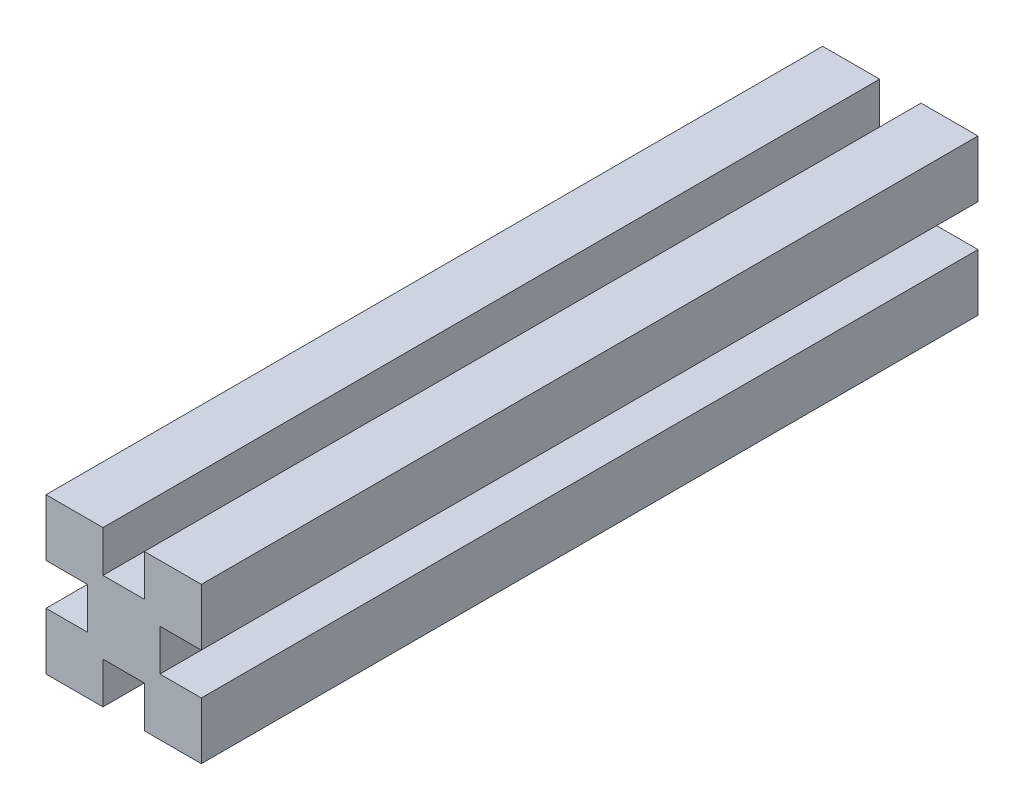
ISO-10303-21;
HEADER;
FILE_DESCRIPTION(('STEP AP214'),'2;1');
FILE_NAME('part.step','',(''),(''),'','','');
FILE_SCHEMA(('AUTOMOTIVE_DESIGN { 1 0 10303 214 1 1 1 1 }'));
ENDSEC;
DATA;
#1=APPLICATION_CONTEXT('core data for automotive mechanical design processes');
#2=APPLICATION_PROTOCOL_DEFINITION('international standard','automotive_design',2000,#1);
#3=PRODUCT_CONTEXT('',#1,'mechanical');
#4=PRODUCT('Part','Part','',(#3));
#5=PRODUCT_RELATED_PRODUCT_CATEGORY('part','',(#4));
#6=PRODUCT_DEFINITION_FORMATION('','',#4);
#7=PRODUCT_DEFINITION_CONTEXT('part definition',#1,'design');
#8=PRODUCT_DEFINITION('design','',#6,#7);
#9=PRODUCT_DEFINITION_SHAPE('','',#8);
#10=(LENGTH_UNIT() NAMED_UNIT(*) SI_UNIT(.MILLI.,.METRE.));
#11=(NAMED_UNIT(*) PLANE_ANGLE_UNIT() SI_UNIT($,.RADIAN.));
#12=(NAMED_UNIT(*) SI_UNIT($,.STERADIAN.) SOLID_ANGLE_UNIT());
#13=UNCERTAINTY_MEASURE_WITH_UNIT(LENGTH_MEASURE(1.E-05),#10,'distance_accuracy_value','');
#14=(GEOMETRIC_REPRESENTATION_CONTEXT(3) GLOBAL_UNCERTAINTY_ASSIGNED_CONTEXT((#13)) GLOBAL_UNIT_ASSIGNED_CONTEXT((#10,
#11,#12)) REPRESENTATION_CONTEXT('',''));
#15=CARTESIAN_POINT('',(0.,0.,0.));
#16=DIRECTION('',(0.,0.,1.));
#17=DIRECTION('',(1.,0.,0.));
#18=AXIS2_PLACEMENT_3D('',#15,#16,#17);
#19=CARTESIAN_POINT('',(-4.,-7.,75.));
#20=DIRECTION('',(-1.,0.,0.));
#21=DIRECTION('',(0.,0.,1.));
#22=AXIS2_PLACEMENT_3D('',#19,#20,#21);
#23=PLANE('',#22);
#24=DIRECTION('',(0.,1.,0.));
#25=VECTOR('',#24,1.);
#26=CARTESIAN_POINT('',(-4.,0.,75.));
#27=LINE('',#26,#25);
#28=CARTESIAN_POINT('',(-4.,-15.,75.));
#29=VERTEX_POINT('',#28);
#30=CARTESIAN_POINT('',(-4.,-7.,75.));
#31=VERTEX_POINT('',#30);
#32=EDGE_CURVE('E223',#29,#31,#27,.T.);
#33=ORIENTED_EDGE('',*,*,#32,.F.);
#34=DIRECTION('',(0.,0.,-1.));
#35=VECTOR('',#34,1.);
#36=CARTESIAN_POINT('',(-4.,-15.,-75.));
#37=LINE('',#36,#35);
#38=CARTESIAN_POINT('',(-4.,-15.,-75.));
#39=VERTEX_POINT('',#38);
#40=EDGE_CURVE('E160',#39,#29,#37,.F.);
#41=ORIENTED_EDGE('',*,*,#40,.F.);
#42=DIRECTION('',(0.,1.,0.));
#43=VECTOR('',#42,1.);
#44=CARTESIAN_POINT('',(-4.,0.,-75.));
#45=LINE('',#44,#43);
#46=CARTESIAN_POINT('',(-4.,-7.,-75.));
#47=VERTEX_POINT('',#46);
#48=EDGE_CURVE('E157',#39,#47,#45,.T.);
#49=ORIENTED_EDGE('',*,*,#48,.T.);
#50=DIRECTION('',(0.,0.,1.));
#51=VECTOR('',#50,1.);
#52=CARTESIAN_POINT('',(-4.,-7.,75.));
#53=LINE('',#52,#51);
#54=EDGE_CURVE('E20',#47,#31,#53,.T.);
#55=ORIENTED_EDGE('',*,*,#54,.T.);
#56=EDGE_LOOP('',(#33,#41,#49,#55));
#57=FACE_BOUND('',#56,.T.);
#58=ADVANCED_FACE('F17',(#57),#23,.F.);
#59=CARTESIAN_POINT('',(4.,-7.,75.));
#60=DIRECTION('',(0.,1.,0.));
#61=DIRECTION('',(0.,0.,1.));
#62=AXIS2_PLACEMENT_3D('',#59,#60,#61);
#63=PLANE('',#62);
#64=DIRECTION('',(1.,0.,0.));
#65=VECTOR('',#64,1.);
#66=CARTESIAN_POINT('',(0.,-7.,75.));
#67=LINE('',#66,#65);
#68=CARTESIAN_POINT('',(4.,-7.,75.));
#69=VERTEX_POINT('',#68);
#70=EDGE_CURVE('E167',#31,#69,#67,.T.);
#71=ORIENTED_EDGE('',*,*,#70,.F.);
#72=ORIENTED_EDGE('',*,*,#54,.F.);
#73=DIRECTION('',(1.,0.,0.));
#74=VECTOR('',#73,1.);
#75=CARTESIAN_POINT('',(0.,-7.,-75.));
#76=LINE('',#75,#74);
#77=CARTESIAN_POINT('',(4.,-7.,-75.));
#78=VERTEX_POINT('',#77);
#79=EDGE_CURVE('E152',#47,#78,#76,.T.);
#80=ORIENTED_EDGE('',*,*,#79,.T.);
#81=DIRECTION('',(0.,0.,-1.));
#82=VECTOR('',#81,1.);
#83=CARTESIAN_POINT('',(4.,-7.,75.));
#84=LINE('',#83,#82);
#85=EDGE_CURVE('E169',#78,#69,#84,.F.);
#86=ORIENTED_EDGE('',*,*,#85,.T.);
#87=EDGE_LOOP('',(#71,#72,#80,#86));
#88=FACE_BOUND('',#87,.T.);
#89=ADVANCED_FACE('F165',(#88),#63,.F.);
#90=CARTESIAN_POINT('',(4.,-15.,75.));
#91=DIRECTION('',(1.,0.,0.));
#92=DIRECTION('',(0.,0.,-1.));
#93=AXIS2_PLACEMENT_3D('',#90,#91,#92);
#94=PLANE('',#93);
#95=DIRECTION('',(0.,1.,0.));
#96=VECTOR('',#95,1.);
#97=CARTESIAN_POINT('',(4.,0.,75.));
#98=LINE('',#97,#96);
#99=CARTESIAN_POINT('',(4.,-15.,75.));
#100=VERTEX_POINT('',#99);
#101=EDGE_CURVE('E215',#69,#100,#98,.F.);
#102=ORIENTED_EDGE('',*,*,#101,.F.);
#103=ORIENTED_EDGE('',*,*,#85,.F.);
#104=DIRECTION('',(0.,1.,0.));
#105=VECTOR('',#104,1.);
#106=CARTESIAN_POINT('',(4.,0.,-75.));
#107=LINE('',#106,#105);
#108=CARTESIAN_POINT('',(4.,-15.,-75.));
#109=VERTEX_POINT('',#108);
#110=EDGE_CURVE('E174',#78,#109,#107,.F.);
#111=ORIENTED_EDGE('',*,*,#110,.T.);
#112=DIRECTION('',(0.,0.,-1.));
#113=VECTOR('',#112,1.);
#114=CARTESIAN_POINT('',(4.,-15.,-75.));
#115=LINE('',#114,#113);
#116=EDGE_CURVE('E210',#100,#109,#115,.T.);
#117=ORIENTED_EDGE('',*,*,#116,.F.);
#118=EDGE_LOOP('',(#102,#103,#111,#117));
#119=FACE_BOUND('',#118,.T.);
#120=ADVANCED_FACE('F216',(#119),#94,.F.);
#121=CARTESIAN_POINT('',(-15.,-15.,-75.));
#122=DIRECTION('',(0.,-1.,0.));
#123=DIRECTION('',(0.,0.,-1.));
#124=AXIS2_PLACEMENT_3D('',#121,#122,#123);
#125=PLANE('',#124);
#126=DIRECTION('',(1.,0.,0.));
#127=VECTOR('',#126,1.);
#128=CARTESIAN_POINT('',(0.,-15.,75.));
#129=LINE('',#128,#127);
#130=CARTESIAN_POINT('',(15.,-15.,75.));
#131=VERTEX_POINT('',#130);
#132=EDGE_CURVE('E219',#100,#131,#129,.T.);
#133=ORIENTED_EDGE('',*,*,#132,.F.);
#134=ORIENTED_EDGE('',*,*,#116,.T.);
#135=DIRECTION('',(1.,0.,0.));
#136=VECTOR('',#135,1.);
#137=CARTESIAN_POINT('',(0.,-15.,-75.));
#138=LINE('',#137,#136);
#139=CARTESIAN_POINT('',(15.,-15.,-75.));
#140=VERTEX_POINT('',#139);
#141=EDGE_CURVE('E176',#109,#140,#138,.T.);
#142=ORIENTED_EDGE('',*,*,#141,.T.);
#143=DIRECTION('',(0.,0.,-1.));
#144=VECTOR('',#143,1.);
#145=CARTESIAN_POINT('',(15.,-15.,-75.));
#146=LINE('',#145,#144);
#147=EDGE_CURVE('E207',#131,#140,#146,.T.);
#148=ORIENTED_EDGE('',*,*,#147,.F.);
#149=EDGE_LOOP('',(#133,#134,#142,#148));
#150=FACE_BOUND('',#149,.T.);
#151=ADVANCED_FACE('F259',(#150),#125,.T.);
#152=CARTESIAN_POINT('',(15.,-15.,-75.));
#153=DIRECTION('',(1.,0.,0.));
#154=DIRECTION('',(0.,0.,-1.));
#155=AXIS2_PLACEMENT_3D('',#152,#153,#154);
#156=PLANE('',#155);
#157=DIRECTION('',(0.,1.,0.));
#158=VECTOR('',#157,1.);
#159=CARTESIAN_POINT('',(15.,0.,-75.));
#160=LINE('',#159,#158);
#161=CARTESIAN_POINT('',(15.,-4.,-75.));
#162=VERTEX_POINT('',#161);
#163=EDGE_CURVE('E257',#140,#162,#160,.T.);
#164=ORIENTED_EDGE('',*,*,#163,.T.);
#165=DIRECTION('',(0.,0.,-1.));
#166=VECTOR('',#165,1.);
#167=CARTESIAN_POINT('',(15.,-4.,75.));
#168=LINE('',#167,#166);
#169=CARTESIAN_POINT('',(15.,-4.,75.));
#170=VERTEX_POINT('',#169);
#171=EDGE_CURVE('E205',#162,#170,#168,.F.);
#172=ORIENTED_EDGE('',*,*,#171,.T.);
#173=DIRECTION('',(0.,1.,0.));
#174=VECTOR('',#173,1.);
#175=CARTESIAN_POINT('',(15.,0.,75.));
#176=LINE('',#175,#174);
#177=EDGE_CURVE('E266',#131,#170,#176,.T.);
#178=ORIENTED_EDGE('',*,*,#177,.F.);
#179=ORIENTED_EDGE('',*,*,#147,.T.);
#180=EDGE_LOOP('',(#164,#172,#178,#179));
#181=FACE_BOUND('',#180,.T.);
#182=ADVANCED_FACE('F263',(#181),#156,.T.);
#183=CARTESIAN_POINT('',(7.,-4.,75.));
#184=DIRECTION('',(0.,-1.,0.));
#185=DIRECTION('',(0.,0.,-1.));
#186=AXIS2_PLACEMENT_3D('',#183,#184,#185);
#187=PLANE('',#186);
#188=DIRECTION('',(1.,0.,0.));
#189=VECTOR('',#188,1.);
#190=CARTESIAN_POINT('',(0.,-4.,75.));
#191=LINE('',#190,#189);
#192=CARTESIAN_POINT('',(7.,-4.,75.));
#193=VERTEX_POINT('',#192);
#194=EDGE_CURVE('E284',#170,#193,#191,.F.);
#195=ORIENTED_EDGE('',*,*,#194,.F.);
#196=ORIENTED_EDGE('',*,*,#171,.F.);
#197=DIRECTION('',(1.,0.,0.));
#198=VECTOR('',#197,1.);
#199=CARTESIAN_POINT('',(0.,-4.,-75.));
#200=LINE('',#199,#198);
#201=CARTESIAN_POINT('',(7.,-4.,-75.));
#202=VERTEX_POINT('',#201);
#203=EDGE_CURVE('E255',#162,#202,#200,.F.);
#204=ORIENTED_EDGE('',*,*,#203,.T.);
#205=DIRECTION('',(0.,0.,1.));
#206=VECTOR('',#205,1.);
#207=CARTESIAN_POINT('',(7.,-4.,75.));
#208=LINE('',#207,#206);
#209=EDGE_CURVE('E203',#202,#193,#208,.T.);
#210=ORIENTED_EDGE('',*,*,#209,.T.);
#211=EDGE_LOOP('',(#195,#196,#204,#210));
#212=FACE_BOUND('',#211,.T.);
#213=ADVANCED_FACE('F273',(#212),#187,.F.);
#214=CARTESIAN_POINT('',(7.,4.,75.));
#215=DIRECTION('',(-1.,0.,0.));
#216=DIRECTION('',(0.,0.,1.));
#217=AXIS2_PLACEMENT_3D('',#214,#215,#216);
#218=PLANE('',#217);
#219=DIRECTION('',(0.,1.,0.));
#220=VECTOR('',#219,1.);
#221=CARTESIAN_POINT('',(7.,0.,75.));
#222=LINE('',#221,#220);
#223=CARTESIAN_POINT('',(7.,4.,75.));
#224=VERTEX_POINT('',#223);
#225=EDGE_CURVE('E279',#193,#224,#222,.T.);
#226=ORIENTED_EDGE('',*,*,#225,.F.);
#227=ORIENTED_EDGE('',*,*,#209,.F.);
#228=DIRECTION('',(0.,1.,0.));
#229=VECTOR('',#228,1.);
#230=CARTESIAN_POINT('',(7.,0.,-75.));
#231=LINE('',#230,#229);
#232=CARTESIAN_POINT('',(7.,4.,-75.));
#233=VERTEX_POINT('',#232);
#234=EDGE_CURVE('E253',#202,#233,#231,.T.);
#235=ORIENTED_EDGE('',*,*,#234,.T.);
#236=DIRECTION('',(0.,0.,1.));
#237=VECTOR('',#236,1.);
#238=CARTESIAN_POINT('',(7.,4.,75.));
#239=LINE('',#238,#237);
#240=EDGE_CURVE('E201',#233,#224,#239,.T.);
#241=ORIENTED_EDGE('',*,*,#240,.T.);
#242=EDGE_LOOP('',(#226,#227,#235,#241));
#243=FACE_BOUND('',#242,.T.);
#244=ADVANCED_FACE('F276',(#243),#218,.F.);
#245=CARTESIAN_POINT('',(15.,4.,75.));
#246=DIRECTION('',(0.,1.,0.));
#247=DIRECTION('',(0.,0.,1.));
#248=AXIS2_PLACEMENT_3D('',#245,#246,#247);
#249=PLANE('',#248);
#250=DIRECTION('',(1.,0.,0.));
#251=VECTOR('',#250,1.);
#252=CARTESIAN_POINT('',(0.,4.,75.));
#253=LINE('',#252,#251);
#254=CARTESIAN_POINT('',(15.,4.,75.));
#255=VERTEX_POINT('',#254);
#256=EDGE_CURVE('E283',#224,#255,#253,.T.);
#257=ORIENTED_EDGE('',*,*,#256,.F.);
#258=ORIENTED_EDGE('',*,*,#240,.F.);
#259=DIRECTION('',(1.,0.,0.));
#260=VECTOR('',#259,1.);
#261=CARTESIAN_POINT('',(0.,4.,-75.));
#262=LINE('',#261,#260);
#263=CARTESIAN_POINT('',(15.,4.,-75.));
#264=VERTEX_POINT('',#263);
#265=EDGE_CURVE('E251',#233,#264,#262,.T.);
#266=ORIENTED_EDGE('',*,*,#265,.T.);
#267=DIRECTION('',(0.,0.,-1.));
#268=VECTOR('',#267,1.);
#269=CARTESIAN_POINT('',(15.,4.,-75.));
#270=LINE('',#269,#268);
#271=EDGE_CURVE('E198',#255,#264,#270,.T.);
#272=ORIENTED_EDGE('',*,*,#271,.F.);
#273=EDGE_LOOP('',(#257,#258,#266,#272));
#274=FACE_BOUND('',#273,.T.);
#275=ADVANCED_FACE('F379',(#274),#249,.F.);
#276=CARTESIAN_POINT('',(15.,-15.,-75.));
#277=DIRECTION('',(1.,0.,0.));
#278=DIRECTION('',(0.,0.,-1.));
#279=AXIS2_PLACEMENT_3D('',#276,#277,#278);
#280=PLANE('',#279);
#281=DIRECTION('',(0.,1.,0.));
#282=VECTOR('',#281,1.);
#283=CARTESIAN_POINT('',(15.,0.,75.));
#284=LINE('',#283,#282);
#285=CARTESIAN_POINT('',(15.,15.,75.));
#286=VERTEX_POINT('',#285);
#287=EDGE_CURVE('E290',#255,#286,#284,.T.);
#288=ORIENTED_EDGE('',*,*,#287,.F.);
#289=ORIENTED_EDGE('',*,*,#271,.T.);
#290=DIRECTION('',(0.,1.,0.));
#291=VECTOR('',#290,1.);
#292=CARTESIAN_POINT('',(15.,0.,-75.));
#293=LINE('',#292,#291);
#294=CARTESIAN_POINT('',(15.,15.,-75.));
#295=VERTEX_POINT('',#294);
#296=EDGE_CURVE('E249',#264,#295,#293,.T.);
#297=ORIENTED_EDGE('',*,*,#296,.T.);
#298=DIRECTION('',(0.,0.,1.));
#299=VECTOR('',#298,1.);
#300=CARTESIAN_POINT('',(15.,15.,-75.));
#301=LINE('',#300,#299);
#302=EDGE_CURVE('E195',#286,#295,#301,.F.);
#303=ORIENTED_EDGE('',*,*,#302,.F.);
#304=EDGE_LOOP('',(#288,#289,#297,#303));
#305=FACE_BOUND('',#304,.T.);
#306=ADVANCED_FACE('F377',(#305),#280,.T.);
#307=CARTESIAN_POINT('',(15.,15.,-75.));
#308=DIRECTION('',(0.,1.,0.));
#309=DIRECTION('',(0.,0.,1.));
#310=AXIS2_PLACEMENT_3D('',#307,#308,#309);
#311=PLANE('',#310);
#312=DIRECTION('',(1.,0.,0.));
#313=VECTOR('',#312,1.);
#314=CARTESIAN_POINT('',(0.,15.,-75.));
#315=LINE('',#314,#313);
#316=CARTESIAN_POINT('',(4.,15.,-75.));
#317=VERTEX_POINT('',#316);
#318=EDGE_CURVE('E247',#295,#317,#315,.F.);
#319=ORIENTED_EDGE('',*,*,#318,.T.);
#320=DIRECTION('',(0.,0.,-1.));
#321=VECTOR('',#320,1.);
#322=CARTESIAN_POINT('',(4.,15.,75.));
#323=LINE('',#322,#321);
#324=CARTESIAN_POINT('',(4.,15.,75.));
#325=VERTEX_POINT('',#324);
#326=EDGE_CURVE('E193',#317,#325,#323,.F.);
#327=ORIENTED_EDGE('',*,*,#326,.T.);
#328=DIRECTION('',(1.,0.,0.));
#329=VECTOR('',#328,1.);
#330=CARTESIAN_POINT('',(0.,15.,75.));
#331=LINE('',#330,#329);
#332=EDGE_CURVE('E293',#286,#325,#331,.F.);
#333=ORIENTED_EDGE('',*,*,#332,.F.);
#334=ORIENTED_EDGE('',*,*,#302,.T.);
#335=EDGE_LOOP('',(#319,#327,#333,#334));
#336=FACE_BOUND('',#335,.T.);
#337=ADVANCED_FACE('F373',(#336),#311,.T.);
#338=CARTESIAN_POINT('',(4.,7.,75.));
#339=DIRECTION('',(1.,0.,0.));
#340=DIRECTION('',(0.,0.,-1.));
#341=AXIS2_PLACEMENT_3D('',#338,#339,#340);
#342=PLANE('',#341);
#343=DIRECTION('',(0.,1.,0.));
#344=VECTOR('',#343,1.);
#345=CARTESIAN_POINT('',(4.,0.,75.));
#346=LINE('',#345,#344);
#347=CARTESIAN_POINT('',(4.,7.,75.));
#348=VERTEX_POINT('',#347);
#349=EDGE_CURVE('E296',#325,#348,#346,.F.);
#350=ORIENTED_EDGE('',*,*,#349,.F.);
#351=ORIENTED_EDGE('',*,*,#326,.F.);
#352=DIRECTION('',(0.,1.,0.));
#353=VECTOR('',#352,1.);
#354=CARTESIAN_POINT('',(4.,0.,-75.));
#355=LINE('',#354,#353);
#356=CARTESIAN_POINT('',(4.,7.,-75.));
#357=VERTEX_POINT('',#356);
#358=EDGE_CURVE('E245',#317,#357,#355,.F.);
#359=ORIENTED_EDGE('',*,*,#358,.T.);
#360=DIRECTION('',(0.,0.,-1.));
#361=VECTOR('',#360,1.);
#362=CARTESIAN_POINT('',(4.,7.,75.));
#363=LINE('',#362,#361);
#364=EDGE_CURVE('E191',#357,#348,#363,.F.);
#365=ORIENTED_EDGE('',*,*,#364,.T.);
#366=EDGE_LOOP('',(#350,#351,#359,#365));
#367=FACE_BOUND('',#366,.T.);
#368=ADVANCED_FACE('F369',(#367),#342,.F.);
#369=CARTESIAN_POINT('',(-4.,7.,75.));
#370=DIRECTION('',(0.,-1.,0.));
#371=DIRECTION('',(0.,0.,-1.));
#372=AXIS2_PLACEMENT_3D('',#369,#370,#371);
#373=PLANE('',#372);
#374=DIRECTION('',(1.,0.,0.));
#375=VECTOR('',#374,1.);
#376=CARTESIAN_POINT('',(0.,7.,75.));
#377=LINE('',#376,#375);
#378=CARTESIAN_POINT('',(-4.,7.,75.));
#379=VERTEX_POINT('',#378);
#380=EDGE_CURVE('E299',#348,#379,#377,.F.);
#381=ORIENTED_EDGE('',*,*,#380,.F.);
#382=ORIENTED_EDGE('',*,*,#364,.F.);
#383=DIRECTION('',(1.,0.,0.));
#384=VECTOR('',#383,1.);
#385=CARTESIAN_POINT('',(0.,7.,-75.));
#386=LINE('',#385,#384);
#387=CARTESIAN_POINT('',(-4.,7.,-75.));
#388=VERTEX_POINT('',#387);
#389=EDGE_CURVE('E243',#357,#388,#386,.F.);
#390=ORIENTED_EDGE('',*,*,#389,.T.);
#391=DIRECTION('',(0.,0.,1.));
#392=VECTOR('',#391,1.);
#393=CARTESIAN_POINT('',(-4.,7.,75.));
#394=LINE('',#393,#392);
#395=EDGE_CURVE('E189',#388,#379,#394,.T.);
#396=ORIENTED_EDGE('',*,*,#395,.T.);
#397=EDGE_LOOP('',(#381,#382,#390,#396));
#398=FACE_BOUND('',#397,.T.);
#399=ADVANCED_FACE('F366',(#398),#373,.F.);
#400=CARTESIAN_POINT('',(-4.,15.,75.));
#401=DIRECTION('',(-1.,0.,0.));
#402=DIRECTION('',(0.,0.,1.));
#403=AXIS2_PLACEMENT_3D('',#400,#401,#402);
#404=PLANE('',#403);
#405=DIRECTION('',(0.,1.,0.));
#406=VECTOR('',#405,1.);
#407=CARTESIAN_POINT('',(-4.,0.,75.));
#408=LINE('',#407,#406);
#409=CARTESIAN_POINT('',(-4.,15.,75.));
#410=VERTEX_POINT('',#409);
#411=EDGE_CURVE('E302',#379,#410,#408,.T.);
#412=ORIENTED_EDGE('',*,*,#411,.F.);
#413=ORIENTED_EDGE('',*,*,#395,.F.);
#414=DIRECTION('',(0.,1.,0.));
#415=VECTOR('',#414,1.);
#416=CARTESIAN_POINT('',(-4.,0.,-75.));
#417=LINE('',#416,#415);
#418=CARTESIAN_POINT('',(-4.,15.,-75.));
#419=VERTEX_POINT('',#418);
#420=EDGE_CURVE('E241',#388,#419,#417,.T.);
#421=ORIENTED_EDGE('',*,*,#420,.T.);
#422=DIRECTION('',(0.,0.,1.));
#423=VECTOR('',#422,1.);
#424=CARTESIAN_POINT('',(-4.,15.,-75.));
#425=LINE('',#424,#423);
#426=EDGE_CURVE('E186',#410,#419,#425,.F.);
#427=ORIENTED_EDGE('',*,*,#426,.F.);
#428=EDGE_LOOP('',(#412,#413,#421,#427));
#429=FACE_BOUND('',#428,.T.);
#430=ADVANCED_FACE('F358',(#429),#404,.F.);
#431=CARTESIAN_POINT('',(15.,15.,-75.));
#432=DIRECTION('',(0.,1.,0.));
#433=DIRECTION('',(0.,0.,1.));
#434=AXIS2_PLACEMENT_3D('',#431,#432,#433);
#435=PLANE('',#434);
#436=DIRECTION('',(1.,0.,0.));
#437=VECTOR('',#436,1.);
#438=CARTESIAN_POINT('',(0.,15.,75.));
#439=LINE('',#438,#437);
#440=CARTESIAN_POINT('',(-15.,15.,75.));
#441=VERTEX_POINT('',#440);
#442=EDGE_CURVE('E305',#410,#441,#439,.F.);
#443=ORIENTED_EDGE('',*,*,#442,.F.);
#444=ORIENTED_EDGE('',*,*,#426,.T.);
#445=DIRECTION('',(1.,0.,0.));
#446=VECTOR('',#445,1.);
#447=CARTESIAN_POINT('',(0.,15.,-75.));
#448=LINE('',#447,#446);
#449=CARTESIAN_POINT('',(-15.,15.,-75.));
#450=VERTEX_POINT('',#449);
#451=EDGE_CURVE('E239',#419,#450,#448,.F.);
#452=ORIENTED_EDGE('',*,*,#451,.T.);
#453=DIRECTION('',(0.,0.,1.));
#454=VECTOR('',#453,1.);
#455=CARTESIAN_POINT('',(-15.,15.,-75.));
#456=LINE('',#455,#454);
#457=EDGE_CURVE('E183',#441,#450,#456,.F.);
#458=ORIENTED_EDGE('',*,*,#457,.F.);
#459=EDGE_LOOP('',(#443,#444,#452,#458));
#460=FACE_BOUND('',#459,.T.);
#461=ADVANCED_FACE('F355',(#460),#435,.T.);
#462=CARTESIAN_POINT('',(-15.,15.,-75.));
#463=DIRECTION('',(-1.,0.,0.));
#464=DIRECTION('',(0.,0.,1.));
#465=AXIS2_PLACEMENT_3D('',#462,#463,#464);
#466=PLANE('',#465);
#467=DIRECTION('',(0.,1.,0.));
#468=VECTOR('',#467,1.);
#469=CARTESIAN_POINT('',(-15.,0.,-75.));
#470=LINE('',#469,#468);
#471=CARTESIAN_POINT('',(-15.,4.,-75.));
#472=VERTEX_POINT('',#471);
#473=EDGE_CURVE('E237',#450,#472,#470,.F.);
#474=ORIENTED_EDGE('',*,*,#473,.T.);
#475=DIRECTION('',(0.,0.,1.));
#476=VECTOR('',#475,1.);
#477=CARTESIAN_POINT('',(-15.,4.,75.));
#478=LINE('',#477,#476);
#479=CARTESIAN_POINT('',(-15.,4.,75.));
#480=VERTEX_POINT('',#479);
#481=EDGE_CURVE('E181',#472,#480,#478,.T.);
#482=ORIENTED_EDGE('',*,*,#481,.T.);
#483=DIRECTION('',(0.,1.,0.));
#484=VECTOR('',#483,1.);
#485=CARTESIAN_POINT('',(-15.,0.,75.));
#486=LINE('',#485,#484);
#487=EDGE_CURVE('E308',#441,#480,#486,.F.);
#488=ORIENTED_EDGE('',*,*,#487,.F.);
#489=ORIENTED_EDGE('',*,*,#457,.T.);
#490=EDGE_LOOP('',(#474,#482,#488,#489));
#491=FACE_BOUND('',#490,.T.);
#492=ADVANCED_FACE('F352',(#491),#466,.T.);
#493=CARTESIAN_POINT('',(-7.,4.,75.));
#494=DIRECTION('',(0.,1.,0.));
#495=DIRECTION('',(0.,0.,1.));
#496=AXIS2_PLACEMENT_3D('',#493,#494,#495);
#497=PLANE('',#496);
#498=DIRECTION('',(1.,0.,0.));
#499=VECTOR('',#498,1.);
#500=CARTESIAN_POINT('',(0.,4.,75.));
#501=LINE('',#500,#499);
#502=CARTESIAN_POINT('',(-7.,4.,75.));
#503=VERTEX_POINT('',#502);
#504=EDGE_CURVE('E311',#480,#503,#501,.T.);
#505=ORIENTED_EDGE('',*,*,#504,.F.);
#506=ORIENTED_EDGE('',*,*,#481,.F.);
#507=DIRECTION('',(1.,0.,0.));
#508=VECTOR('',#507,1.);
#509=CARTESIAN_POINT('',(0.,4.,-75.));
#510=LINE('',#509,#508);
#511=CARTESIAN_POINT('',(-7.,4.,-75.));
#512=VERTEX_POINT('',#511);
#513=EDGE_CURVE('E235',#472,#512,#510,.T.);
#514=ORIENTED_EDGE('',*,*,#513,.T.);
#515=DIRECTION('',(0.,0.,-1.));
#516=VECTOR('',#515,1.);
#517=CARTESIAN_POINT('',(-7.,4.,75.));
#518=LINE('',#517,#516);
#519=EDGE_CURVE('E163',#512,#503,#518,.F.);
#520=ORIENTED_EDGE('',*,*,#519,.T.);
#521=EDGE_LOOP('',(#505,#506,#514,#520));
#522=FACE_BOUND('',#521,.T.);
#523=ADVANCED_FACE('F347',(#522),#497,.F.);
#524=CARTESIAN_POINT('',(-7.,-4.,75.));
#525=DIRECTION('',(1.,0.,0.));
#526=DIRECTION('',(0.,0.,-1.));
#527=AXIS2_PLACEMENT_3D('',#524,#525,#526);
#528=PLANE('',#527);
#529=DIRECTION('',(0.,1.,0.));
#530=VECTOR('',#529,1.);
#531=CARTESIAN_POINT('',(-7.,0.,75.));
#532=LINE('',#531,#530);
#533=CARTESIAN_POINT('',(-7.,-4.,75.));
#534=VERTEX_POINT('',#533);
#535=EDGE_CURVE('E314',#503,#534,#532,.F.);
#536=ORIENTED_EDGE('',*,*,#535,.F.);
#537=ORIENTED_EDGE('',*,*,#519,.F.);
#538=DIRECTION('',(0.,1.,0.));
#539=VECTOR('',#538,1.);
#540=CARTESIAN_POINT('',(-7.,0.,-75.));
#541=LINE('',#540,#539);
#542=CARTESIAN_POINT('',(-7.,-4.,-75.));
#543=VERTEX_POINT('',#542);
#544=EDGE_CURVE('E233',#512,#543,#541,.F.);
#545=ORIENTED_EDGE('',*,*,#544,.T.);
#546=DIRECTION('',(0.,0.,-1.));
#547=VECTOR('',#546,1.);
#548=CARTESIAN_POINT('',(-7.,-4.,75.));
#549=LINE('',#548,#547);
#550=EDGE_CURVE('E319',#543,#534,#549,.F.);
#551=ORIENTED_EDGE('',*,*,#550,.T.);
#552=EDGE_LOOP('',(#536,#537,#545,#551));
#553=FACE_BOUND('',#552,.T.);
#554=ADVANCED_FACE('F341',(#553),#528,.F.);
#555=CARTESIAN_POINT('',(0.,0.,-75.));
#556=DIRECTION('',(0.,0.,1.));
#557=DIRECTION('',(1.,0.,0.));
#558=AXIS2_PLACEMENT_3D('',#555,#556,#557);
#559=PLANE('',#558);
#560=ORIENTED_EDGE('',*,*,#513,.F.);
#561=ORIENTED_EDGE('',*,*,#473,.F.);
#562=ORIENTED_EDGE('',*,*,#451,.F.);
#563=ORIENTED_EDGE('',*,*,#420,.F.);
#564=ORIENTED_EDGE('',*,*,#389,.F.);
#565=ORIENTED_EDGE('',*,*,#358,.F.);
#566=ORIENTED_EDGE('',*,*,#318,.F.);
#567=ORIENTED_EDGE('',*,*,#296,.F.);
#568=ORIENTED_EDGE('',*,*,#265,.F.);
#569=ORIENTED_EDGE('',*,*,#234,.F.);
#570=ORIENTED_EDGE('',*,*,#203,.F.);
#571=ORIENTED_EDGE('',*,*,#163,.F.);
#572=ORIENTED_EDGE('',*,*,#141,.F.);
#573=ORIENTED_EDGE('',*,*,#110,.F.);
#574=ORIENTED_EDGE('',*,*,#79,.F.);
#575=ORIENTED_EDGE('',*,*,#48,.F.);
#576=DIRECTION('',(1.,0.,0.));
#577=VECTOR('',#576,1.);
#578=CARTESIAN_POINT('',(-15.,-15.,-75.));
#579=LINE('',#578,#577);
#580=CARTESIAN_POINT('',(-15.,-15.,-75.));
#581=VERTEX_POINT('',#580);
#582=EDGE_CURVE('E231',#581,#39,#579,.T.);
#583=ORIENTED_EDGE('',*,*,#582,.F.);
#584=DIRECTION('',(0.,1.,0.));
#585=VECTOR('',#584,1.);
#586=CARTESIAN_POINT('',(-15.,15.,-75.));
#587=LINE('',#586,#585);
#588=CARTESIAN_POINT('',(-15.,-4.,-75.));
#589=VERTEX_POINT('',#588);
#590=EDGE_CURVE('E322',#589,#581,#587,.F.);
#591=ORIENTED_EDGE('',*,*,#590,.F.);
#592=DIRECTION('',(1.,0.,0.));
#593=VECTOR('',#592,1.);
#594=CARTESIAN_POINT('',(-15.,-4.,-75.));
#595=LINE('',#594,#593);
#596=EDGE_CURVE('E316',#589,#543,#595,.T.);
#597=ORIENTED_EDGE('',*,*,#596,.T.);
#598=ORIENTED_EDGE('',*,*,#544,.F.);
#599=EDGE_LOOP('',(#560,#561,#562,#563,#564,#565,#566,#567,#568,#569,#570,#571,#572,#573,#574,
#575,#583,#591,#597,#598));
#600=FACE_BOUND('',#599,.T.);
#601=ADVANCED_FACE('F172',(#600),#559,.F.);
#602=CARTESIAN_POINT('',(-15.,-15.,-75.));
#603=DIRECTION('',(0.,-1.,0.));
#604=DIRECTION('',(0.,0.,-1.));
#605=AXIS2_PLACEMENT_3D('',#602,#603,#604);
#606=PLANE('',#605);
#607=ORIENTED_EDGE('',*,*,#582,.T.);
#608=ORIENTED_EDGE('',*,*,#40,.T.);
#609=DIRECTION('',(1.,0.,0.));
#610=VECTOR('',#609,1.);
#611=CARTESIAN_POINT('',(0.,-15.,75.));
#612=LINE('',#611,#610);
#613=CARTESIAN_POINT('',(-15.,-15.,75.));
#614=VERTEX_POINT('',#613);
#615=EDGE_CURVE('E225',#614,#29,#612,.T.);
#616=ORIENTED_EDGE('',*,*,#615,.F.);
#617=DIRECTION('',(0.,0.,1.));
#618=VECTOR('',#617,1.);
#619=CARTESIAN_POINT('',(-15.,-15.,-75.));
#620=LINE('',#619,#618);
#621=EDGE_CURVE('E325',#581,#614,#620,.T.);
#622=ORIENTED_EDGE('',*,*,#621,.F.);
#623=EDGE_LOOP('',(#607,#608,#616,#622));
#624=FACE_BOUND('',#623,.T.);
#625=ADVANCED_FACE('F333',(#624),#606,.T.);
#626=CARTESIAN_POINT('',(0.,0.,75.));
#627=DIRECTION('',(0.,0.,1.));
#628=DIRECTION('',(1.,0.,0.));
#629=AXIS2_PLACEMENT_3D('',#626,#627,#628);
#630=PLANE('',#629);
#631=ORIENTED_EDGE('',*,*,#535,.T.);
#632=DIRECTION('',(1.,0.,0.));
#633=VECTOR('',#632,1.);
#634=CARTESIAN_POINT('',(-15.,-4.,75.));
#635=LINE('',#634,#633);
#636=CARTESIAN_POINT('',(-15.,-4.,75.));
#637=VERTEX_POINT('',#636);
#638=EDGE_CURVE('E35',#534,#637,#635,.F.);
#639=ORIENTED_EDGE('',*,*,#638,.T.);
#640=DIRECTION('',(0.,1.,0.));
#641=VECTOR('',#640,1.);
#642=CARTESIAN_POINT('',(-15.,15.,75.));
#643=LINE('',#642,#641);
#644=EDGE_CURVE('E26',#614,#637,#643,.T.);
#645=ORIENTED_EDGE('',*,*,#644,.F.);
#646=ORIENTED_EDGE('',*,*,#615,.T.);
#647=ORIENTED_EDGE('',*,*,#32,.T.);
#648=ORIENTED_EDGE('',*,*,#70,.T.);
#649=ORIENTED_EDGE('',*,*,#101,.T.);
#650=ORIENTED_EDGE('',*,*,#132,.T.);
#651=ORIENTED_EDGE('',*,*,#177,.T.);
#652=ORIENTED_EDGE('',*,*,#194,.T.);
#653=ORIENTED_EDGE('',*,*,#225,.T.);
#654=ORIENTED_EDGE('',*,*,#256,.T.);
#655=ORIENTED_EDGE('',*,*,#287,.T.);
#656=ORIENTED_EDGE('',*,*,#332,.T.);
#657=ORIENTED_EDGE('',*,*,#349,.T.);
#658=ORIENTED_EDGE('',*,*,#380,.T.);
#659=ORIENTED_EDGE('',*,*,#411,.T.);
#660=ORIENTED_EDGE('',*,*,#442,.T.);
#661=ORIENTED_EDGE('',*,*,#487,.T.);
#662=ORIENTED_EDGE('',*,*,#504,.T.);
#663=EDGE_LOOP('',(#631,#639,#645,#646,#647,#648,#649,#650,#651,#652,#653,#654,#655,#656,#657,
#658,#659,#660,#661,#662));
#664=FACE_BOUND('',#663,.T.);
#665=ADVANCED_FACE('F221',(#664),#630,.T.);
#666=CARTESIAN_POINT('',(-15.,-4.,75.));
#667=DIRECTION('',(0.,-1.,0.));
#668=DIRECTION('',(0.,0.,-1.));
#669=AXIS2_PLACEMENT_3D('',#666,#667,#668);
#670=PLANE('',#669);
#671=ORIENTED_EDGE('',*,*,#638,.F.);
#672=ORIENTED_EDGE('',*,*,#550,.F.);
#673=ORIENTED_EDGE('',*,*,#596,.F.);
#674=DIRECTION('',(0.,0.,1.));
#675=VECTOR('',#674,1.);
#676=CARTESIAN_POINT('',(-15.,-4.,-75.));
#677=LINE('',#676,#675);
#678=EDGE_CURVE('E11',#637,#589,#677,.F.);
#679=ORIENTED_EDGE('',*,*,#678,.F.);
#680=EDGE_LOOP('',(#671,#672,#673,#679));
#681=FACE_BOUND('',#680,.T.);
#682=ADVANCED_FACE('F338',(#681),#670,.F.);
#683=CARTESIAN_POINT('',(-15.,15.,-75.));
#684=DIRECTION('',(-1.,0.,0.));
#685=DIRECTION('',(0.,0.,1.));
#686=AXIS2_PLACEMENT_3D('',#683,#684,#685);
#687=PLANE('',#686);
#688=ORIENTED_EDGE('',*,*,#644,.T.);
#689=ORIENTED_EDGE('',*,*,#678,.T.);
#690=ORIENTED_EDGE('',*,*,#590,.T.);
#691=ORIENTED_EDGE('',*,*,#621,.T.);
#692=EDGE_LOOP('',(#688,#689,#690,#691));
#693=FACE_BOUND('',#692,.T.);
#694=ADVANCED_FACE('F330',(#693),#687,.T.);
#695=CLOSED_SHELL('',(#58,#89,#120,#151,#182,#213,#244,#275,#306,#337,#368,#399,#430,#461,#492,
#523,#554,#601,#625,#665,#682,#694));
#696=MANIFOLD_SOLID_BREP('B1',#695);
#697=ADVANCED_BREP_SHAPE_REPRESENTATION('',(#18,#696),#14);
#698=SHAPE_DEFINITION_REPRESENTATION(#9,#697);
ENDSEC;
END-ISO-10303-21;
